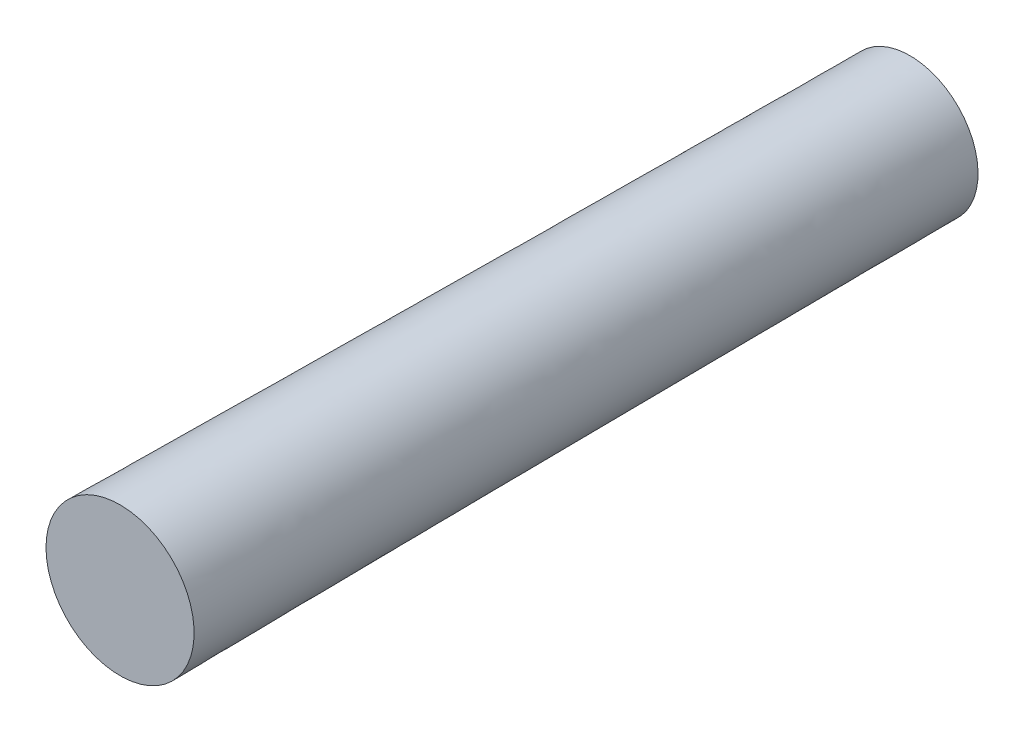
ISO-10303-21;
HEADER;
FILE_DESCRIPTION(('STEP AP214'),'2;1');
FILE_NAME('part.step','',(''),(''),'','','');
FILE_SCHEMA(('AUTOMOTIVE_DESIGN { 1 0 10303 214 1 1 1 1 }'));
ENDSEC;
DATA;
#1=APPLICATION_CONTEXT('core data for automotive mechanical design processes');
#2=APPLICATION_PROTOCOL_DEFINITION('international standard','automotive_design',2000,#1);
#3=PRODUCT_CONTEXT('',#1,'mechanical');
#4=PRODUCT('Part','Part','',(#3));
#5=PRODUCT_RELATED_PRODUCT_CATEGORY('part','',(#4));
#6=PRODUCT_DEFINITION_FORMATION('','',#4);
#7=PRODUCT_DEFINITION_CONTEXT('part definition',#1,'design');
#8=PRODUCT_DEFINITION('design','',#6,#7);
#9=PRODUCT_DEFINITION_SHAPE('','',#8);
#10=(LENGTH_UNIT() NAMED_UNIT(*) SI_UNIT(.MILLI.,.METRE.));
#11=(NAMED_UNIT(*) PLANE_ANGLE_UNIT() SI_UNIT($,.RADIAN.));
#12=(NAMED_UNIT(*) SI_UNIT($,.STERADIAN.) SOLID_ANGLE_UNIT());
#13=UNCERTAINTY_MEASURE_WITH_UNIT(LENGTH_MEASURE(1.E-05),#10,'distance_accuracy_value','');
#14=(GEOMETRIC_REPRESENTATION_CONTEXT(3) GLOBAL_UNCERTAINTY_ASSIGNED_CONTEXT((#13)) GLOBAL_UNIT_ASSIGNED_CONTEXT((#10,
#11,#12)) REPRESENTATION_CONTEXT('',''));
#15=CARTESIAN_POINT('',(0.,0.,0.));
#16=DIRECTION('',(0.,0.,1.));
#17=DIRECTION('',(1.,0.,0.));
#18=AXIS2_PLACEMENT_3D('',#15,#16,#17);
#19=CARTESIAN_POINT('',(0.,0.,0.));
#20=DIRECTION('',(0.,0.,1.));
#21=DIRECTION('',(1.,0.,0.));
#22=AXIS2_PLACEMENT_3D('',#19,#20,#21);
#23=PLANE('',#22);
#24=CARTESIAN_POINT('',(0.,0.,0.));
#25=DIRECTION('',(0.,0.,1.));
#26=DIRECTION('',(1.,0.,0.));
#27=AXIS2_PLACEMENT_3D('',#24,#25,#26);
#28=CIRCLE('',#27,8.763);
#29=CARTESIAN_POINT('',(-8.43174968309751,2.38658045780672,0.));
#30=VERTEX_POINT('',#29);
#31=EDGE_CURVE('E11',#30,#30,#28,.T.);
#32=ORIENTED_EDGE('',*,*,#31,.F.);
#33=EDGE_LOOP('',(#32));
#34=FACE_BOUND('',#33,.T.);
#35=ADVANCED_FACE('F35',(#34),#23,.F.);
#36=CARTESIAN_POINT('',(0.,0.,101.6));
#37=DIRECTION('',(0.,0.,1.));
#38=DIRECTION('',(1.,0.,0.));
#39=AXIS2_PLACEMENT_3D('',#36,#37,#38);
#40=PLANE('',#39);
#41=CARTESIAN_POINT('',(0.,0.,101.6));
#42=DIRECTION('',(0.,0.,1.));
#43=DIRECTION('',(1.,0.,0.));
#44=AXIS2_PLACEMENT_3D('',#41,#42,#43);
#45=CIRCLE('',#44,9.525);
#46=CARTESIAN_POINT('',(-9.5248796700365,-0.0478776704257421,101.6));
#47=VERTEX_POINT('',#46);
#48=EDGE_CURVE('E43',#47,#47,#45,.T.);
#49=ORIENTED_EDGE('',*,*,#48,.T.);
#50=EDGE_LOOP('',(#49));
#51=FACE_BOUND('',#50,.T.);
#52=ADVANCED_FACE('F67',(#51),#40,.T.);
#53=CARTESIAN_POINT('',(-9.5248796700365,-0.0478776704257421,101.6));
#54=CARTESIAN_POINT('',(-8.43174968309751,2.38658045780672,0.));
#55=CARTESIAN_POINT('',(-9.62063501088798,19.0018816696473,101.6));
#56=CARTESIAN_POINT('',(-3.65858876748408,19.2500798240017,0.));
#57=CARTESIAN_POINT('',(9.42912432918501,19.0976370104987,101.6));
#58=CARTESIAN_POINT('',(13.204910598711,14.4769189083883,0.));
#59=CARTESIAN_POINT('',(9.5248796700365,0.0478776704257433,101.6));
#60=CARTESIAN_POINT('',(8.43174968309751,-2.38658045780672,0.));
#61=CARTESIAN_POINT('',(9.62063501088799,-19.0018816696472,101.6));
#62=CARTESIAN_POINT('',(3.65858876748407,-19.2500798240018,0.));
#63=CARTESIAN_POINT('',(-9.42912432918501,-19.0976370104987,101.6));
#64=CARTESIAN_POINT('',(-13.204910598711,-14.4769189083883,0.));
#65=CARTESIAN_POINT('',(-9.5248796700365,-0.0478776704257421,101.6));
#66=CARTESIAN_POINT('',(-8.43174968309751,2.38658045780672,0.));
#67=(BOUNDED_SURFACE() B_SPLINE_SURFACE(3,1,((#53,#54),(#55,#56),(#57,#58),(#59,#60),(#61,#62),
(#63,#64),(#65,#66)),.UNSPECIFIED.,.T.,.F.,.F.) B_SPLINE_SURFACE_WITH_KNOTS((4,3,4),(2,2),(0.,
0.5,1.),(0.,1.),.UNSPECIFIED.) GEOMETRIC_REPRESENTATION_ITEM() RATIONAL_B_SPLINE_SURFACE(((1.,
1.),(0.333333333333333,0.333333333333333),(0.333333333333333,0.333333333333333),(1.,1.),
(0.333333333333334,0.333333333333333),(0.333333333333334,0.333333333333333),(1.,1.))) REPRESENTATION_ITEM('') SURFACE());
#68=CARTESIAN_POINT('',(-9.5248796700365,-0.0478776704257421,101.6));
#69=CARTESIAN_POINT('',(-9.51349289933922,-0.0225187315899874,100.541666666667));
#70=CARTESIAN_POINT('',(-9.50210612864194,0.00284020724576743,99.4833333333333));
#71=CARTESIAN_POINT('',(-9.47933258724738,0.0535580849172771,97.3666666666667));
#72=CARTESIAN_POINT('',(-9.46794581655009,0.078917023753032,96.3083333333333));
#73=CARTESIAN_POINT('',(-9.44517227515553,0.129634901424542,94.1916666666667));
#74=CARTESIAN_POINT('',(-9.43378550445825,0.154993840260296,93.1333333333333));
#75=CARTESIAN_POINT('',(-9.41101196306369,0.205711717931806,91.0166666666667));
#76=CARTESIAN_POINT('',(-9.39962519236641,0.231070656767561,89.9583333333333));
#77=CARTESIAN_POINT('',(-9.37685165097185,0.28178853443907,87.8416666666667));
#78=CARTESIAN_POINT('',(-9.36546488027456,0.307147473274825,86.7833333333333));
#79=CARTESIAN_POINT('',(-9.34269133888,0.357865350946335,84.6666666666667));
#80=CARTESIAN_POINT('',(-9.33130456818272,0.38322428978209,83.6083333333333));
#81=CARTESIAN_POINT('',(-9.30853102678816,0.433942167453599,81.4916666666667));
#82=CARTESIAN_POINT('',(-9.29714425609088,0.459301106289354,80.4333333333333));
#83=CARTESIAN_POINT('',(-9.27437071469632,0.510018983960864,78.3166666666667));
#84=CARTESIAN_POINT('',(-9.26298394399904,0.535377922796618,77.2583333333333));
#85=CARTESIAN_POINT('',(-9.24021040260448,0.586095800468128,75.1416666666667));
#86=CARTESIAN_POINT('',(-9.22882363190719,0.611454739303883,74.0833333333333));
#87=CARTESIAN_POINT('',(-9.20605009051263,0.662172616975392,71.9666666666667));
#88=CARTESIAN_POINT('',(-9.19466331981535,0.687531555811147,70.9083333333333));
#89=CARTESIAN_POINT('',(-9.17188977842079,0.738249433482657,68.7916666666667));
#90=CARTESIAN_POINT('',(-9.1605030077235,0.763608372318412,67.7333333333333));
#91=CARTESIAN_POINT('',(-9.13772946632894,0.814326249989921,65.6166666666667));
#92=CARTESIAN_POINT('',(-9.12634269563166,0.839685188825676,64.5583333333333));
#93=CARTESIAN_POINT('',(-9.1035691542371,0.890403066497186,62.4416666666667));
#94=CARTESIAN_POINT('',(-9.09218238353982,0.91576200533294,61.3833333333333));
#95=CARTESIAN_POINT('',(-9.06940884214526,0.96647988300445,59.2666666666667));
#96=CARTESIAN_POINT('',(-9.05802207144798,0.991838821840205,58.2083333333333));
#97=CARTESIAN_POINT('',(-9.03524853005341,1.04255669951171,56.0916666666667));
#98=CARTESIAN_POINT('',(-9.02386175935613,1.06791563834747,55.0333333333333));
#99=CARTESIAN_POINT('',(-9.00108821796157,1.11863351601898,52.9166666666667));
#100=CARTESIAN_POINT('',(-8.98970144726429,1.14399245485473,51.8583333333333));
#101=CARTESIAN_POINT('',(-8.96692790586973,1.19471033252624,49.7416666666667));
#102=CARTESIAN_POINT('',(-8.95554113517245,1.220069271362,48.6833333333333));
#103=CARTESIAN_POINT('',(-8.93276759377788,1.27078714903351,46.5666666666667));
#104=CARTESIAN_POINT('',(-8.9213808230806,1.29614608786926,45.5083333333333));
#105=CARTESIAN_POINT('',(-8.89860728168604,1.34686396554077,43.3916666666667));
#106=CARTESIAN_POINT('',(-8.88722051098876,1.37222290437653,42.3333333333333));
#107=CARTESIAN_POINT('',(-8.8644469695942,1.42294078204804,40.2166666666667));
#108=CARTESIAN_POINT('',(-8.85306019889691,1.44829972088379,39.1583333333333));
#109=CARTESIAN_POINT('',(-8.83028665750235,1.4990175985553,37.0416666666667));
#110=CARTESIAN_POINT('',(-8.81889988680507,1.52437653739106,35.9833333333333));
#111=CARTESIAN_POINT('',(-8.79612634541051,1.57509441506257,33.8666666666667));
#112=CARTESIAN_POINT('',(-8.78473957471323,1.60045335389832,32.8083333333333));
#113=CARTESIAN_POINT('',(-8.76196603331867,1.65117123156983,30.6916666666667));
#114=CARTESIAN_POINT('',(-8.75057926262139,1.67653017040558,29.6333333333333));
#115=CARTESIAN_POINT('',(-8.72780572122682,1.72724804807709,27.5166666666667));
#116=CARTESIAN_POINT('',(-8.71641895052954,1.75260698691285,26.4583333333333));
#117=CARTESIAN_POINT('',(-8.69364540913498,1.80332486458436,24.3416666666667));
#118=CARTESIAN_POINT('',(-8.6822586384377,1.82868380342011,23.2833333333333));
#119=CARTESIAN_POINT('',(-8.65948509704314,1.87940168109162,21.1666666666667));
#120=CARTESIAN_POINT('',(-8.64809832634585,1.90476061992738,20.1083333333333));
#121=CARTESIAN_POINT('',(-8.62532478495129,1.95547849759889,17.9916666666667));
#122=CARTESIAN_POINT('',(-8.61393801425401,1.98083743643464,16.9333333333333));
#123=CARTESIAN_POINT('',(-8.59116447285945,2.03155531410615,14.8166666666667));
#124=CARTESIAN_POINT('',(-8.57977770216217,2.05691425294191,13.7583333333333));
#125=CARTESIAN_POINT('',(-8.55700416076761,2.10763213061342,11.6416666666667));
#126=CARTESIAN_POINT('',(-8.54561739007032,2.13299106944917,10.5833333333333));
#127=CARTESIAN_POINT('',(-8.52284384867576,2.18370894712068,8.46666666666667));
#128=CARTESIAN_POINT('',(-8.51145707797848,2.20906788595644,7.40833333333333));
#129=CARTESIAN_POINT('',(-8.48868353658392,2.25978576362794,5.29166666666667));
#130=CARTESIAN_POINT('',(-8.47729676588664,2.2851447024637,4.23333333333333));
#131=CARTESIAN_POINT('',(-8.45452322449208,2.33586258013521,2.11666666666667));
#132=CARTESIAN_POINT('',(-8.4431364537948,2.36122151897096,1.05833333333333));
#133=CARTESIAN_POINT('',(-8.43174968309751,2.38658045780672,0.));
#134=B_SPLINE_CURVE_WITH_KNOTS('',3,(#68,#69,#70,#71,#72,#73,#74,#75,#76,#77,#78,#79,#80,#81,
#82,#83,#84,#85,#86,#87,#88,#89,#90,#91,#92,#93,#94,#95,#96,#97,#98,#99,#100,#101,#102,#103,
#104,#105,#106,#107,#108,#109,#110,#111,#112,#113,#114,#115,#116,#117,#118,#119,#120,#121,#122,
#123,#124,#125,#126,#127,#128,#129,#130,#131,#132,#133),.UNSPECIFIED.,.F.,.F.,(4,2,2,2,2,2,2,2,
2,2,2,2,2,2,2,2,2,2,2,2,2,2,2,2,2,2,2,2,2,2,2,2,4),(0.,3.17609502517353,6.35219005034707,
9.52828507552062,12.7043801006942,15.8804751258677,19.0565701510412,22.2326651762148,
25.4087602013883,28.5848552265618,31.7609502517354,34.9370452769089,38.1131403020824,
41.289235327256,44.4653303524295,47.6414253776031,50.8175204027766,53.9936154279501,
57.1697104531237,60.3458054782972,63.5219005034707,66.6979955286443,69.8740905538178,
73.0501855789913,76.2262806041649,79.4023756293384,82.5784706545119,85.7545656796855,
88.930660704859,92.1067557300325,95.2828507552061,98.4589457803796,101.635040805553),.UNSPECIFIED.);
#135=EDGE_CURVE('BSEAM75',#47,#30,#134,.T.);
#136=ORIENTED_EDGE('',*,*,#48,.F.);
#137=ORIENTED_EDGE('',*,*,#31,.T.);
#138=ORIENTED_EDGE('',*,*,#135,.T.);
#139=ORIENTED_EDGE('',*,*,#135,.F.);
#140=EDGE_LOOP('',(#136,#138,#137,#139));
#141=FACE_BOUND('',#140,.T.);
#142=ADVANCED_FACE('F75',(#141),#67,.T.);
#143=CLOSED_SHELL('',(#35,#52,#142));
#144=MANIFOLD_SOLID_BREP('B2',#143);
#145=ADVANCED_BREP_SHAPE_REPRESENTATION('',(#18,#144),#14);
#146=SHAPE_DEFINITION_REPRESENTATION(#9,#145);
ENDSEC;
END-ISO-10303-21;
